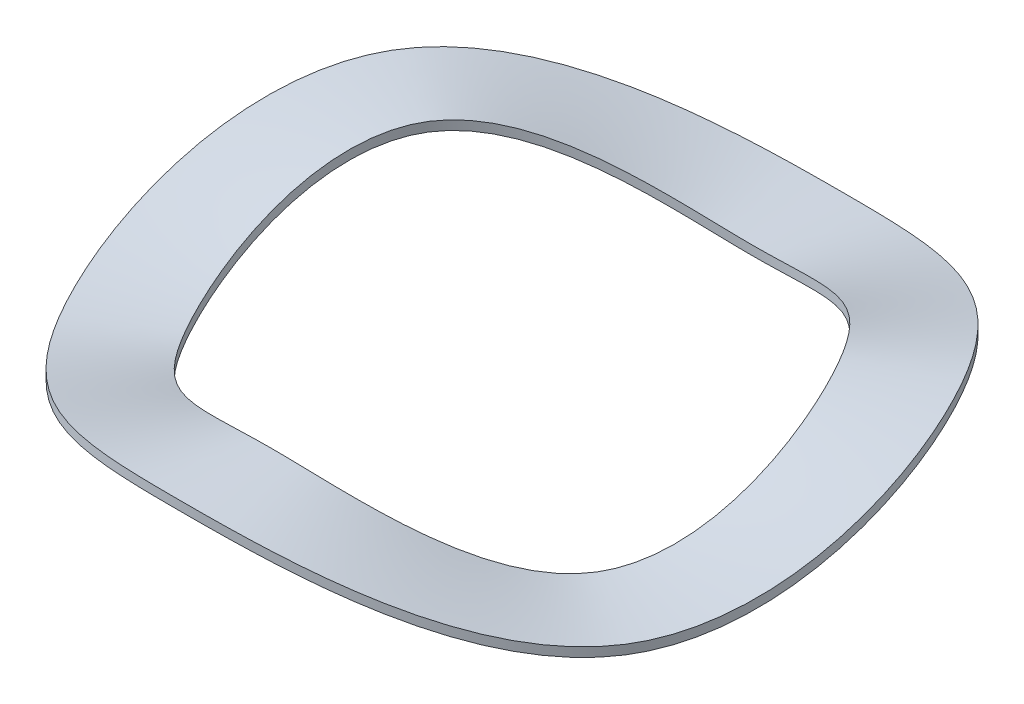
ISO-10303-21;
HEADER;
FILE_DESCRIPTION(('STEP AP214'),'2;1');
FILE_NAME('part.step','',(''),(''),'','','');
FILE_SCHEMA(('AUTOMOTIVE_DESIGN { 1 0 10303 214 1 1 1 1 }'));
ENDSEC;
DATA;
#1=APPLICATION_CONTEXT('core data for automotive mechanical design processes');
#2=APPLICATION_PROTOCOL_DEFINITION('international standard','automotive_design',2000,#1);
#3=PRODUCT_CONTEXT('',#1,'mechanical');
#4=PRODUCT('Part','Part','',(#3));
#5=PRODUCT_RELATED_PRODUCT_CATEGORY('part','',(#4));
#6=PRODUCT_DEFINITION_FORMATION('','',#4);
#7=PRODUCT_DEFINITION_CONTEXT('part definition',#1,'design');
#8=PRODUCT_DEFINITION('design','',#6,#7);
#9=PRODUCT_DEFINITION_SHAPE('','',#8);
#10=(LENGTH_UNIT() NAMED_UNIT(*) SI_UNIT(.MILLI.,.METRE.));
#11=(NAMED_UNIT(*) PLANE_ANGLE_UNIT() SI_UNIT($,.RADIAN.));
#12=(NAMED_UNIT(*) SI_UNIT($,.STERADIAN.) SOLID_ANGLE_UNIT());
#13=UNCERTAINTY_MEASURE_WITH_UNIT(LENGTH_MEASURE(1.E-05),#10,'distance_accuracy_value','');
#14=(GEOMETRIC_REPRESENTATION_CONTEXT(3) GLOBAL_UNCERTAINTY_ASSIGNED_CONTEXT((#13)) GLOBAL_UNIT_ASSIGNED_CONTEXT((#10,
#11,#12)) REPRESENTATION_CONTEXT('',''));
#15=CARTESIAN_POINT('',(0.,0.,0.));
#16=DIRECTION('',(0.,0.,1.));
#17=DIRECTION('',(1.,0.,0.));
#18=AXIS2_PLACEMENT_3D('',#15,#16,#17);
#19=CARTESIAN_POINT('',(0.,0.,-10.8966));
#20=CARTESIAN_POINT('',(3.774692965951,0.,-10.8966));
#21=CARTESIAN_POINT('',(11.324078897853,4.1148,-6.53795999999999));
#22=CARTESIAN_POINT('',(11.324078897853,-2.0574,6.53796000000003));
#23=CARTESIAN_POINT('',(0.,4.11479999999999,13.07592));
#24=CARTESIAN_POINT('',(-11.3240788978531,-2.0574,6.53795999999995));
#25=CARTESIAN_POINT('',(-11.324078897853,2.0574,-2.17932000000005));
#26=CARTESIAN_POINT('',(-7.54938593190198,2.0574,-8.71728000000004));
#27=CARTESIAN_POINT('',(-3.774692965951,0.,-10.8966));
#28=CARTESIAN_POINT('',(0.,0.,-10.8966));
#29=CARTESIAN_POINT('',(0.,0.1016,-10.8966));
#30=CARTESIAN_POINT('',(3.774692965951,0.1016,-10.8966));
#31=CARTESIAN_POINT('',(11.324078897853,4.2164,-6.53795999999999));
#32=CARTESIAN_POINT('',(11.324078897853,-1.9558,6.53796000000003));
#33=CARTESIAN_POINT('',(0.,4.21639999999999,13.07592));
#34=CARTESIAN_POINT('',(-11.3240788978531,-1.9558,6.53795999999995));
#35=CARTESIAN_POINT('',(-11.324078897853,2.159,-2.17932000000005));
#36=CARTESIAN_POINT('',(-7.54938593190198,2.159,-8.71728000000004));
#37=CARTESIAN_POINT('',(-3.774692965951,0.1016,-10.8966));
#38=CARTESIAN_POINT('',(0.,0.1016,-10.8966));
#39=CARTESIAN_POINT('',(0.,0.2032,-10.8966));
#40=CARTESIAN_POINT('',(3.774692965951,0.2032,-10.8966));
#41=CARTESIAN_POINT('',(11.324078897853,4.318,-6.53795999999999));
#42=CARTESIAN_POINT('',(11.324078897853,-1.8542,6.53796000000003));
#43=CARTESIAN_POINT('',(0.,4.31799999999999,13.07592));
#44=CARTESIAN_POINT('',(-11.3240788978531,-1.8542,6.53795999999995));
#45=CARTESIAN_POINT('',(-11.324078897853,2.2606,-2.17932000000005));
#46=CARTESIAN_POINT('',(-7.54938593190198,2.2606,-8.71728000000004));
#47=CARTESIAN_POINT('',(-3.774692965951,0.2032,-10.8966));
#48=CARTESIAN_POINT('',(0.,0.2032,-10.8966));
#49=CARTESIAN_POINT('',(0.,0.3048,-10.8966));
#50=CARTESIAN_POINT('',(3.774692965951,0.3048,-10.8966));
#51=CARTESIAN_POINT('',(11.324078897853,4.4196,-6.53795999999999));
#52=CARTESIAN_POINT('',(11.324078897853,-1.7526,6.53796000000003));
#53=CARTESIAN_POINT('',(0.,4.41959999999999,13.07592));
#54=CARTESIAN_POINT('',(-11.3240788978531,-1.7526,6.53795999999995));
#55=CARTESIAN_POINT('',(-11.324078897853,2.3622,-2.17932000000005));
#56=CARTESIAN_POINT('',(-7.54938593190198,2.3622,-8.71728000000004));
#57=CARTESIAN_POINT('',(-3.774692965951,0.3048,-10.8966));
#58=CARTESIAN_POINT('',(0.,0.3048,-10.8966));
#59=B_SPLINE_SURFACE_WITH_KNOTS('',3,3,((#19,#20,#21,#22,#23,#24,#25,#26,#27,#28),(#29,#30,#31,
#32,#33,#34,#35,#36,#37,#38),(#39,#40,#41,#42,#43,#44,#45,#46,#47,#48),(#49,#50,#51,#52,#53,#54,
#55,#56,#57,#58)),.UNSPECIFIED.,.F.,.T.,.F.,(4,4),(4,1,1,1,1,2,4),(0.,1.),(0.,0.166666666666667,
0.333333333333334,0.5,0.666666666666666,0.833333333333333,1.),.UNSPECIFIED.);
#60=CARTESIAN_POINT('',(0.,0.,-10.8966));
#61=CARTESIAN_POINT('',(3.774692965951,0.,-10.8966));
#62=CARTESIAN_POINT('',(11.324078897853,4.1148,-6.53795999999999));
#63=CARTESIAN_POINT('',(11.324078897853,-2.0574,6.53796000000003));
#64=CARTESIAN_POINT('',(0.,4.11479999999999,13.07592));
#65=CARTESIAN_POINT('',(-11.3240788978531,-2.0574,6.53795999999995));
#66=CARTESIAN_POINT('',(-11.324078897853,2.0574,-2.17932000000005));
#67=CARTESIAN_POINT('',(-7.54938593190198,2.0574,-8.71728000000004));
#68=CARTESIAN_POINT('',(-3.774692965951,0.,-10.8966));
#69=CARTESIAN_POINT('',(0.,0.,-10.8966));
#70=B_SPLINE_CURVE_WITH_KNOTS('',3,(#60,#61,#62,#63,#64,#65,#66,#67,#68,#69),.UNSPECIFIED.,.T.,
.F.,(4,1,1,1,1,2,4),(0.,0.166666666666667,0.333333333333334,0.5,0.666666666666666,
0.833333333333333,1.),.UNSPECIFIED.);
#71=CARTESIAN_POINT('',(0.,0.,-10.8966));
#72=VERTEX_POINT('',#71);
#73=EDGE_CURVE('E11',#72,#72,#70,.F.);
#74=CARTESIAN_POINT('',(0.,0.3048,-10.8966));
#75=CARTESIAN_POINT('',(3.774692965951,0.3048,-10.8966));
#76=CARTESIAN_POINT('',(11.324078897853,4.4196,-6.53795999999999));
#77=CARTESIAN_POINT('',(11.324078897853,-1.7526,6.53796000000003));
#78=CARTESIAN_POINT('',(0.,4.41959999999999,13.07592));
#79=CARTESIAN_POINT('',(-11.3240788978531,-1.7526,6.53795999999995));
#80=CARTESIAN_POINT('',(-11.324078897853,2.3622,-2.17932000000005));
#81=CARTESIAN_POINT('',(-7.54938593190198,2.3622,-8.71728000000004));
#82=CARTESIAN_POINT('',(-3.774692965951,0.3048,-10.8966));
#83=CARTESIAN_POINT('',(0.,0.3048,-10.8966));
#84=B_SPLINE_CURVE_WITH_KNOTS('',3,(#74,#75,#76,#77,#78,#79,#80,#81,#82,#83),.UNSPECIFIED.,.T.,
.F.,(4,1,1,1,1,2,4),(0.,0.166666666666667,0.333333333333334,0.5,0.666666666666666,
0.833333333333333,1.),.UNSPECIFIED.);
#85=CARTESIAN_POINT('',(0.,0.3048,-10.8966));
#86=VERTEX_POINT('',#85);
#87=EDGE_CURVE('E59',#86,#86,#84,.T.);
#88=ORIENTED_EDGE('',*,*,#73,.T.);
#89=EDGE_LOOP('',(#88));
#90=FACE_BOUND('',#89,.T.);
#91=ORIENTED_EDGE('',*,*,#87,.T.);
#92=EDGE_LOOP('',(#91));
#93=FACE_BOUND('',#92,.T.);
#94=ADVANCED_FACE('F46',(#90,#93),#59,.T.);
#95=CARTESIAN_POINT('',(0.,0.,-7.8994));
#96=CARTESIAN_POINT('',(2.73643242986191,0.,-7.89939999999999));
#97=CARTESIAN_POINT('',(8.20929728958577,4.1148,-4.73963999999999));
#98=CARTESIAN_POINT('',(8.20929728958573,-2.0574,4.73964000000002));
#99=CARTESIAN_POINT('',(0.,4.11479999999999,9.47928));
#100=CARTESIAN_POINT('',(-8.2092972895858,-2.0574,4.73963999999996));
#101=CARTESIAN_POINT('',(-8.20929728958573,2.0574,-1.57988000000003));
#102=CARTESIAN_POINT('',(-5.47286485972381,2.0574,-6.31952000000003));
#103=CARTESIAN_POINT('',(-2.73643242986191,0.,-7.89940000000001));
#104=CARTESIAN_POINT('',(0.,0.,-7.8994));
#105=CARTESIAN_POINT('',(0.,0.,-8.89846666666667));
#106=CARTESIAN_POINT('',(3.08251927522494,0.,-8.89846666666666));
#107=CARTESIAN_POINT('',(9.24755782567486,4.1148,-5.33907999999999));
#108=CARTESIAN_POINT('',(9.24755782567482,-2.0574,5.33908000000002));
#109=CARTESIAN_POINT('',(0.,4.11479999999999,10.67816));
#110=CARTESIAN_POINT('',(-9.24755782567489,-2.0574,5.33907999999996));
#111=CARTESIAN_POINT('',(-9.24755782567482,2.0574,-1.77969333333337));
#112=CARTESIAN_POINT('',(-6.16503855044987,2.0574,-7.11877333333336));
#113=CARTESIAN_POINT('',(-3.08251927522494,0.,-8.89846666666668));
#114=CARTESIAN_POINT('',(0.,0.,-8.89846666666667));
#115=CARTESIAN_POINT('',(0.,0.,-9.89753333333333));
#116=CARTESIAN_POINT('',(3.42860612058797,0.,-9.89753333333332));
#117=CARTESIAN_POINT('',(10.2858183617639,4.1148,-5.93851999999999));
#118=CARTESIAN_POINT('',(10.2858183617639,-2.0574,5.93852000000002));
#119=CARTESIAN_POINT('',(0.,4.11479999999999,11.87704));
#120=CARTESIAN_POINT('',(-10.285818361764,-2.0574,5.93851999999995));
#121=CARTESIAN_POINT('',(-10.2858183617639,2.0574,-1.97950666666671));
#122=CARTESIAN_POINT('',(-6.85721224117592,2.0574,-7.9180266666667));
#123=CARTESIAN_POINT('',(-3.42860612058797,0.,-9.89753333333335));
#124=CARTESIAN_POINT('',(0.,0.,-9.89753333333333));
#125=CARTESIAN_POINT('',(0.,0.,-10.8966));
#126=CARTESIAN_POINT('',(3.774692965951,0.,-10.8966));
#127=CARTESIAN_POINT('',(11.324078897853,4.1148,-6.53795999999999));
#128=CARTESIAN_POINT('',(11.324078897853,-2.0574,6.53796000000003));
#129=CARTESIAN_POINT('',(0.,4.11479999999999,13.07592));
#130=CARTESIAN_POINT('',(-11.3240788978531,-2.0574,6.53795999999995));
#131=CARTESIAN_POINT('',(-11.324078897853,2.0574,-2.17932000000005));
#132=CARTESIAN_POINT('',(-7.54938593190198,2.0574,-8.71728000000004));
#133=CARTESIAN_POINT('',(-3.774692965951,0.,-10.8966));
#134=CARTESIAN_POINT('',(0.,0.,-10.8966));
#135=B_SPLINE_SURFACE_WITH_KNOTS('',3,3,((#95,#96,#97,#98,#99,#100,#101,#102,#103,#104),(#105,
#106,#107,#108,#109,#110,#111,#112,#113,#114),(#115,#116,#117,#118,#119,#120,#121,#122,#123,
#124),(#125,#126,#127,#128,#129,#130,#131,#132,#133,#134)),.UNSPECIFIED.,.F.,.T.,.F.,(4,4),(4,1,
1,1,1,2,4),(0.,1.),(0.,0.166666666666667,0.333333333333334,0.5,0.666666666666666,
0.833333333333333,1.),.UNSPECIFIED.);
#136=CARTESIAN_POINT('',(0.,0.,-7.8994));
#137=CARTESIAN_POINT('',(2.73643242986191,0.,-7.89939999999999));
#138=CARTESIAN_POINT('',(8.20929728958576,4.1148,-4.73963999999999));
#139=CARTESIAN_POINT('',(8.20929728958573,-2.0574,4.73964000000002));
#140=CARTESIAN_POINT('',(0.,4.11479999999999,9.47928));
#141=CARTESIAN_POINT('',(-8.20929728958579,-2.0574,4.73963999999996));
#142=CARTESIAN_POINT('',(-8.20929728958574,2.0574,-1.57988000000003));
#143=CARTESIAN_POINT('',(-5.47286485972381,2.0574,-6.31952000000003));
#144=CARTESIAN_POINT('',(-2.73643242986191,0.,-7.89940000000001));
#145=CARTESIAN_POINT('',(0.,0.,-7.8994));
#146=B_SPLINE_CURVE_WITH_KNOTS('',3,(#136,#137,#138,#139,#140,#141,#142,#143,#144,#145),
.UNSPECIFIED.,.T.,.F.,(4,1,1,1,1,2,4),(0.,0.166666666666667,0.333333333333334,0.5,
0.666666666666666,0.833333333333333,1.),.UNSPECIFIED.);
#147=CARTESIAN_POINT('',(0.,0.,-7.8994));
#148=VERTEX_POINT('',#147);
#149=EDGE_CURVE('E52',#148,#148,#146,.T.);
#150=ORIENTED_EDGE('',*,*,#149,.F.);
#151=EDGE_LOOP('',(#150));
#152=FACE_BOUND('',#151,.T.);
#153=ORIENTED_EDGE('',*,*,#73,.F.);
#154=EDGE_LOOP('',(#153));
#155=FACE_BOUND('',#154,.T.);
#156=ADVANCED_FACE('F91',(#152,#155),#135,.T.);
#157=CARTESIAN_POINT('',(0.,0.3048,-10.8966));
#158=CARTESIAN_POINT('',(3.774692965951,0.3048,-10.8966));
#159=CARTESIAN_POINT('',(11.324078897853,4.4196,-6.53795999999999));
#160=CARTESIAN_POINT('',(11.324078897853,-1.7526,6.53796000000003));
#161=CARTESIAN_POINT('',(0.,4.41959999999999,13.07592));
#162=CARTESIAN_POINT('',(-11.3240788978531,-1.7526,6.53795999999995));
#163=CARTESIAN_POINT('',(-11.324078897853,2.3622,-2.17932000000005));
#164=CARTESIAN_POINT('',(-7.54938593190198,2.3622,-8.71728000000004));
#165=CARTESIAN_POINT('',(-3.774692965951,0.3048,-10.8966));
#166=CARTESIAN_POINT('',(0.,0.3048,-10.8966));
#167=CARTESIAN_POINT('',(0.,0.3048,-9.89753333333333));
#168=CARTESIAN_POINT('',(3.42860612058797,0.3048,-9.89753333333332));
#169=CARTESIAN_POINT('',(10.2858183617639,4.4196,-5.93851999999999));
#170=CARTESIAN_POINT('',(10.2858183617639,-1.7526,5.93852000000002));
#171=CARTESIAN_POINT('',(0.,4.41959999999999,11.87704));
#172=CARTESIAN_POINT('',(-10.285818361764,-1.7526,5.93851999999995));
#173=CARTESIAN_POINT('',(-10.2858183617639,2.3622,-1.97950666666671));
#174=CARTESIAN_POINT('',(-6.85721224117592,2.3622,-7.9180266666667));
#175=CARTESIAN_POINT('',(-3.42860612058797,0.3048,-9.89753333333335));
#176=CARTESIAN_POINT('',(0.,0.3048,-9.89753333333333));
#177=CARTESIAN_POINT('',(0.,0.3048,-8.89846666666667));
#178=CARTESIAN_POINT('',(3.08251927522494,0.304799999999999,-8.89846666666666));
#179=CARTESIAN_POINT('',(9.24755782567486,4.4196,-5.33907999999999));
#180=CARTESIAN_POINT('',(9.24755782567482,-1.7526,5.33908000000002));
#181=CARTESIAN_POINT('',(0.,4.41959999999999,10.67816));
#182=CARTESIAN_POINT('',(-9.24755782567489,-1.7526,5.33907999999996));
#183=CARTESIAN_POINT('',(-9.24755782567482,2.3622,-1.77969333333337));
#184=CARTESIAN_POINT('',(-6.16503855044987,2.3622,-7.11877333333336));
#185=CARTESIAN_POINT('',(-3.08251927522494,0.3048,-8.89846666666668));
#186=CARTESIAN_POINT('',(0.,0.3048,-8.89846666666667));
#187=CARTESIAN_POINT('',(0.,0.304799999999999,-7.8994));
#188=CARTESIAN_POINT('',(2.73643242986191,0.304799999999999,-7.89939999999999));
#189=CARTESIAN_POINT('',(8.20929728958577,4.4196,-4.73963999999999));
#190=CARTESIAN_POINT('',(8.20929728958573,-1.7526,4.73964000000002));
#191=CARTESIAN_POINT('',(0.,4.41959999999999,9.47928));
#192=CARTESIAN_POINT('',(-8.2092972895858,-1.7526,4.73963999999996));
#193=CARTESIAN_POINT('',(-8.20929728958573,2.3622,-1.57988000000003));
#194=CARTESIAN_POINT('',(-5.47286485972381,2.3622,-6.31952000000003));
#195=CARTESIAN_POINT('',(-2.73643242986191,0.304799999999999,-7.89940000000001));
#196=CARTESIAN_POINT('',(0.,0.304799999999999,-7.8994));
#197=B_SPLINE_SURFACE_WITH_KNOTS('',3,3,((#157,#158,#159,#160,#161,#162,#163,#164,#165,#166),
(#167,#168,#169,#170,#171,#172,#173,#174,#175,#176),(#177,#178,#179,#180,#181,#182,#183,#184,
#185,#186),(#187,#188,#189,#190,#191,#192,#193,#194,#195,#196)),.UNSPECIFIED.,.F.,.T.,.F.,(4,4),
(4,1,1,1,1,2,4),(0.,1.),(0.,0.166666666666667,0.333333333333334,0.5,0.666666666666666,
0.833333333333333,1.),.UNSPECIFIED.);
#198=CARTESIAN_POINT('',(0.,0.304799999999999,-7.8994));
#199=CARTESIAN_POINT('',(2.73643242986191,0.304799999999999,-7.89939999999999));
#200=CARTESIAN_POINT('',(8.20929728958577,4.4196,-4.73963999999999));
#201=CARTESIAN_POINT('',(8.20929728958573,-1.7526,4.73964000000002));
#202=CARTESIAN_POINT('',(0.,4.41959999999999,9.47928));
#203=CARTESIAN_POINT('',(-8.2092972895858,-1.7526,4.73963999999996));
#204=CARTESIAN_POINT('',(-8.20929728958573,2.3622,-1.57988000000003));
#205=CARTESIAN_POINT('',(-5.47286485972381,2.3622,-6.31952000000003));
#206=CARTESIAN_POINT('',(-2.73643242986191,0.304799999999999,-7.89940000000001));
#207=CARTESIAN_POINT('',(0.,0.304799999999999,-7.8994));
#208=B_SPLINE_CURVE_WITH_KNOTS('',3,(#198,#199,#200,#201,#202,#203,#204,#205,#206,#207),
.UNSPECIFIED.,.T.,.F.,(4,1,1,1,1,2,4),(0.,0.166666666666667,0.333333333333334,0.5,
0.666666666666666,0.833333333333333,1.),.UNSPECIFIED.);
#209=CARTESIAN_POINT('',(0.,0.304799999999999,-7.8994));
#210=VERTEX_POINT('',#209);
#211=EDGE_CURVE('E66',#210,#210,#208,.T.);
#212=ORIENTED_EDGE('',*,*,#87,.F.);
#213=EDGE_LOOP('',(#212));
#214=FACE_BOUND('',#213,.T.);
#215=ORIENTED_EDGE('',*,*,#211,.T.);
#216=EDGE_LOOP('',(#215));
#217=FACE_BOUND('',#216,.T.);
#218=ADVANCED_FACE('F94',(#214,#217),#197,.T.);
#219=CARTESIAN_POINT('',(0.,0.304799999999999,-7.8994));
#220=CARTESIAN_POINT('',(2.73643242986191,0.304799999999999,-7.89939999999999));
#221=CARTESIAN_POINT('',(8.20929728958576,4.4196,-4.73963999999999));
#222=CARTESIAN_POINT('',(8.20929728958573,-1.7526,4.73964000000002));
#223=CARTESIAN_POINT('',(0.,4.41959999999999,9.47928));
#224=CARTESIAN_POINT('',(-8.20929728958579,-1.7526,4.73963999999996));
#225=CARTESIAN_POINT('',(-8.20929728958574,2.3622,-1.57988000000003));
#226=CARTESIAN_POINT('',(-5.47286485972381,2.3622,-6.31952000000003));
#227=CARTESIAN_POINT('',(-2.73643242986191,0.304799999999999,-7.89940000000001));
#228=CARTESIAN_POINT('',(0.,0.304799999999999,-7.8994));
#229=CARTESIAN_POINT('',(0.,0.2032,-7.8994));
#230=CARTESIAN_POINT('',(2.73643242986191,0.2032,-7.89939999999999));
#231=CARTESIAN_POINT('',(8.20929728958576,4.318,-4.73963999999999));
#232=CARTESIAN_POINT('',(8.20929728958573,-1.8542,4.73964000000002));
#233=CARTESIAN_POINT('',(0.,4.31799999999999,9.47928));
#234=CARTESIAN_POINT('',(-8.20929728958579,-1.8542,4.73963999999996));
#235=CARTESIAN_POINT('',(-8.20929728958574,2.2606,-1.57988000000003));
#236=CARTESIAN_POINT('',(-5.47286485972381,2.2606,-6.31952000000003));
#237=CARTESIAN_POINT('',(-2.73643242986191,0.2032,-7.89940000000001));
#238=CARTESIAN_POINT('',(0.,0.2032,-7.8994));
#239=CARTESIAN_POINT('',(0.,0.1016,-7.8994));
#240=CARTESIAN_POINT('',(2.73643242986191,0.1016,-7.89939999999999));
#241=CARTESIAN_POINT('',(8.20929728958576,4.2164,-4.73963999999999));
#242=CARTESIAN_POINT('',(8.20929728958573,-1.9558,4.73964000000002));
#243=CARTESIAN_POINT('',(0.,4.21639999999999,9.47928));
#244=CARTESIAN_POINT('',(-8.20929728958579,-1.9558,4.73963999999996));
#245=CARTESIAN_POINT('',(-8.20929728958574,2.159,-1.57988000000003));
#246=CARTESIAN_POINT('',(-5.47286485972381,2.159,-6.31952000000003));
#247=CARTESIAN_POINT('',(-2.73643242986191,0.1016,-7.89940000000001));
#248=CARTESIAN_POINT('',(0.,0.1016,-7.8994));
#249=CARTESIAN_POINT('',(0.,0.,-7.8994));
#250=CARTESIAN_POINT('',(2.73643242986191,0.,-7.89939999999999));
#251=CARTESIAN_POINT('',(8.20929728958576,4.1148,-4.73963999999999));
#252=CARTESIAN_POINT('',(8.20929728958573,-2.0574,4.73964000000002));
#253=CARTESIAN_POINT('',(0.,4.11479999999999,9.47928));
#254=CARTESIAN_POINT('',(-8.20929728958579,-2.0574,4.73963999999996));
#255=CARTESIAN_POINT('',(-8.20929728958574,2.0574,-1.57988000000003));
#256=CARTESIAN_POINT('',(-5.47286485972381,2.0574,-6.31952000000003));
#257=CARTESIAN_POINT('',(-2.73643242986191,0.,-7.89940000000001));
#258=CARTESIAN_POINT('',(0.,0.,-7.8994));
#259=B_SPLINE_SURFACE_WITH_KNOTS('',3,3,((#219,#220,#221,#222,#223,#224,#225,#226,#227,#228),
(#229,#230,#231,#232,#233,#234,#235,#236,#237,#238),(#239,#240,#241,#242,#243,#244,#245,#246,
#247,#248),(#249,#250,#251,#252,#253,#254,#255,#256,#257,#258)),.UNSPECIFIED.,.F.,.T.,.F.,(4,4),
(4,1,1,1,1,2,4),(0.,1.),(0.,0.166666666666667,0.333333333333334,0.5,0.666666666666666,
0.833333333333333,1.),.UNSPECIFIED.);
#260=ORIENTED_EDGE('',*,*,#211,.F.);
#261=EDGE_LOOP('',(#260));
#262=FACE_BOUND('',#261,.T.);
#263=ORIENTED_EDGE('',*,*,#149,.T.);
#264=EDGE_LOOP('',(#263));
#265=FACE_BOUND('',#264,.T.);
#266=ADVANCED_FACE('F48',(#262,#265),#259,.T.);
#267=CLOSED_SHELL('',(#94,#156,#218,#266));
#268=MANIFOLD_SOLID_BREP('B2',#267);
#269=ADVANCED_BREP_SHAPE_REPRESENTATION('',(#18,#268),#14);
#270=SHAPE_DEFINITION_REPRESENTATION(#9,#269);
ENDSEC;
END-ISO-10303-21;
